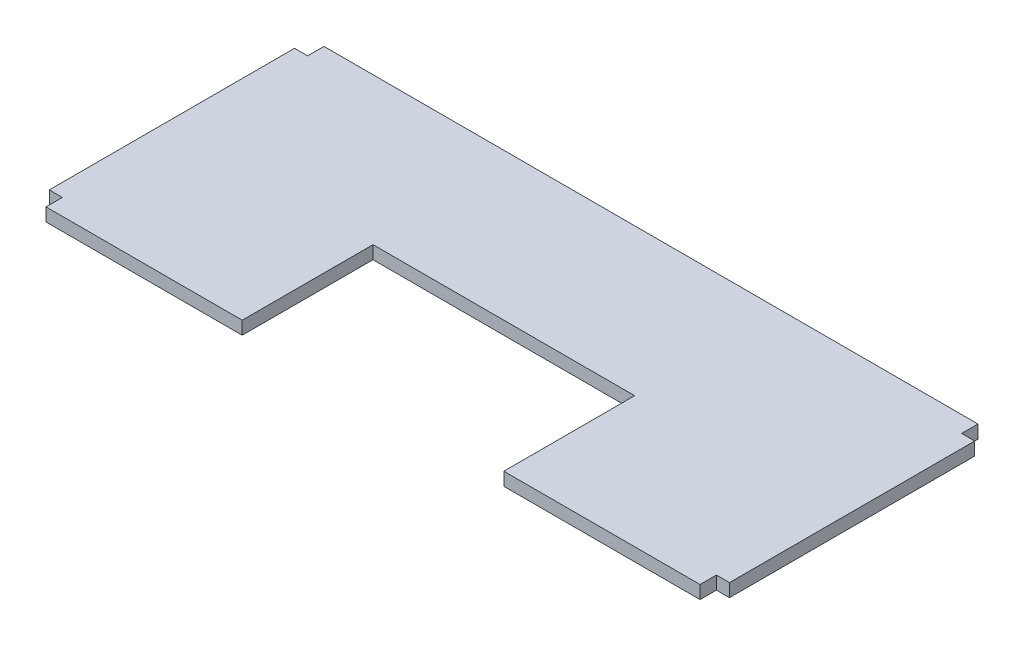
ISO-10303-21;
HEADER;
FILE_DESCRIPTION(('STEP AP214'),'2;1');
FILE_NAME('part.step','',(''),(''),'','','');
FILE_SCHEMA(('AUTOMOTIVE_DESIGN { 1 0 10303 214 1 1 1 1 }'));
ENDSEC;
DATA;
#1=APPLICATION_CONTEXT('core data for automotive mechanical design processes');
#2=APPLICATION_PROTOCOL_DEFINITION('international standard','automotive_design',2000,#1);
#3=PRODUCT_CONTEXT('',#1,'mechanical');
#4=PRODUCT('Part','Part','',(#3));
#5=PRODUCT_RELATED_PRODUCT_CATEGORY('part','',(#4));
#6=PRODUCT_DEFINITION_FORMATION('','',#4);
#7=PRODUCT_DEFINITION_CONTEXT('part definition',#1,'design');
#8=PRODUCT_DEFINITION('design','',#6,#7);
#9=PRODUCT_DEFINITION_SHAPE('','',#8);
#10=(LENGTH_UNIT() NAMED_UNIT(*) SI_UNIT(.MILLI.,.METRE.));
#11=(NAMED_UNIT(*) PLANE_ANGLE_UNIT() SI_UNIT($,.RADIAN.));
#12=(NAMED_UNIT(*) SI_UNIT($,.STERADIAN.) SOLID_ANGLE_UNIT());
#13=UNCERTAINTY_MEASURE_WITH_UNIT(LENGTH_MEASURE(1.E-05),#10,'distance_accuracy_value','');
#14=(GEOMETRIC_REPRESENTATION_CONTEXT(3) GLOBAL_UNCERTAINTY_ASSIGNED_CONTEXT((#13)) GLOBAL_UNIT_ASSIGNED_CONTEXT((#10,
#11,#12)) REPRESENTATION_CONTEXT('',''));
#15=CARTESIAN_POINT('',(0.,0.,0.));
#16=DIRECTION('',(0.,0.,1.));
#17=DIRECTION('',(1.,0.,0.));
#18=AXIS2_PLACEMENT_3D('',#15,#16,#17);
#19=CARTESIAN_POINT('',(0.,2.,0.));
#20=DIRECTION('',(0.,0.,-1.));
#21=DIRECTION('',(-1.,0.,0.));
#22=AXIS2_PLACEMENT_3D('',#19,#20,#21);
#23=PLANE('',#22);
#24=DIRECTION('',(1.,0.,0.));
#25=VECTOR('',#24,1.);
#26=CARTESIAN_POINT('',(0.,0.,0.));
#27=LINE('',#26,#25);
#28=CARTESIAN_POINT('',(0.,0.,0.));
#29=VERTEX_POINT('',#28);
#30=CARTESIAN_POINT('',(30.,0.,0.));
#31=VERTEX_POINT('',#30);
#32=EDGE_CURVE('E249',#29,#31,#27,.T.);
#33=ORIENTED_EDGE('',*,*,#32,.T.);
#34=DIRECTION('',(0.,1.,0.));
#35=VECTOR('',#34,1.);
#36=CARTESIAN_POINT('',(30.,-0.00100000000000013,0.));
#37=LINE('',#36,#35);
#38=CARTESIAN_POINT('',(30.,2.,0.));
#39=VERTEX_POINT('',#38);
#40=EDGE_CURVE('E203',#31,#39,#37,.T.);
#41=ORIENTED_EDGE('',*,*,#40,.T.);
#42=DIRECTION('',(1.,0.,0.));
#43=VECTOR('',#42,1.);
#44=CARTESIAN_POINT('',(0.,2.,0.));
#45=LINE('',#44,#43);
#46=CARTESIAN_POINT('',(0.,2.,0.));
#47=VERTEX_POINT('',#46);
#48=EDGE_CURVE('E192',#47,#39,#45,.T.);
#49=ORIENTED_EDGE('',*,*,#48,.F.);
#50=DIRECTION('',(0.,-1.,0.));
#51=VECTOR('',#50,1.);
#52=CARTESIAN_POINT('',(0.,2.,0.));
#53=LINE('',#52,#51);
#54=EDGE_CURVE('E301',#47,#29,#53,.T.);
#55=ORIENTED_EDGE('',*,*,#54,.T.);
#56=EDGE_LOOP('',(#33,#41,#49,#55));
#57=FACE_BOUND('',#56,.T.);
#58=ADVANCED_FACE('F44',(#57),#23,.F.);
#59=CARTESIAN_POINT('',(-2.,2.,0.));
#60=DIRECTION('',(1.,0.,0.));
#61=DIRECTION('',(0.,0.,-1.));
#62=AXIS2_PLACEMENT_3D('',#59,#60,#61);
#63=PLANE('',#62);
#64=DIRECTION('',(0.,0.,1.));
#65=VECTOR('',#64,1.);
#66=CARTESIAN_POINT('',(-2.,0.,0.));
#67=LINE('',#66,#65);
#68=CARTESIAN_POINT('',(-2.,0.,-40.));
#69=VERTEX_POINT('',#68);
#70=CARTESIAN_POINT('',(-2.,0.,-2.5));
#71=VERTEX_POINT('',#70);
#72=EDGE_CURVE('E202',#69,#71,#67,.T.);
#73=ORIENTED_EDGE('',*,*,#72,.T.);
#74=DIRECTION('',(0.,-1.,0.));
#75=VECTOR('',#74,1.);
#76=CARTESIAN_POINT('',(-2.,2.,-2.5));
#77=LINE('',#76,#75);
#78=CARTESIAN_POINT('',(-2.,2.,-2.5));
#79=VERTEX_POINT('',#78);
#80=EDGE_CURVE('E11',#79,#71,#77,.T.);
#81=ORIENTED_EDGE('',*,*,#80,.F.);
#82=DIRECTION('',(0.,0.,1.));
#83=VECTOR('',#82,1.);
#84=CARTESIAN_POINT('',(-2.,2.,0.));
#85=LINE('',#84,#83);
#86=CARTESIAN_POINT('',(-2.,2.,-40.));
#87=VERTEX_POINT('',#86);
#88=EDGE_CURVE('E193',#87,#79,#85,.T.);
#89=ORIENTED_EDGE('',*,*,#88,.F.);
#90=DIRECTION('',(0.,-1.,0.));
#91=VECTOR('',#90,1.);
#92=CARTESIAN_POINT('',(-2.,2.,-40.));
#93=LINE('',#92,#91);
#94=EDGE_CURVE('E69',#87,#69,#93,.T.);
#95=ORIENTED_EDGE('',*,*,#94,.T.);
#96=EDGE_LOOP('',(#73,#81,#89,#95));
#97=FACE_BOUND('',#96,.T.);
#98=ADVANCED_FACE('F46',(#97),#63,.F.);
#99=CARTESIAN_POINT('',(0.,2.,-2.5));
#100=DIRECTION('',(0.,0.,-1.));
#101=DIRECTION('',(-1.,0.,0.));
#102=AXIS2_PLACEMENT_3D('',#99,#100,#101);
#103=PLANE('',#102);
#104=DIRECTION('',(1.,0.,0.));
#105=VECTOR('',#104,1.);
#106=CARTESIAN_POINT('',(0.,0.,-2.5));
#107=LINE('',#106,#105);
#108=CARTESIAN_POINT('',(0.,0.,-2.5));
#109=VERTEX_POINT('',#108);
#110=EDGE_CURVE('E237',#71,#109,#107,.T.);
#111=ORIENTED_EDGE('',*,*,#110,.T.);
#112=DIRECTION('',(0.,-1.,0.));
#113=VECTOR('',#112,1.);
#114=CARTESIAN_POINT('',(0.,2.,-2.5));
#115=LINE('',#114,#113);
#116=CARTESIAN_POINT('',(0.,2.,-2.5));
#117=VERTEX_POINT('',#116);
#118=EDGE_CURVE('E53',#117,#109,#115,.T.);
#119=ORIENTED_EDGE('',*,*,#118,.F.);
#120=DIRECTION('',(1.,0.,0.));
#121=VECTOR('',#120,1.);
#122=CARTESIAN_POINT('',(0.,2.,-2.5));
#123=LINE('',#122,#121);
#124=EDGE_CURVE('E120',#79,#117,#123,.T.);
#125=ORIENTED_EDGE('',*,*,#124,.F.);
#126=ORIENTED_EDGE('',*,*,#80,.T.);
#127=EDGE_LOOP('',(#111,#119,#125,#126));
#128=FACE_BOUND('',#127,.T.);
#129=ADVANCED_FACE('F306',(#128),#103,.F.);
#130=CARTESIAN_POINT('',(0.,2.,0.));
#131=DIRECTION('',(-1.,0.,0.));
#132=DIRECTION('',(0.,0.,1.));
#133=AXIS2_PLACEMENT_3D('',#130,#131,#132);
#134=PLANE('',#133);
#135=DIRECTION('',(0.,0.,-1.));
#136=VECTOR('',#135,1.);
#137=CARTESIAN_POINT('',(0.,0.,0.));
#138=LINE('',#137,#136);
#139=EDGE_CURVE('E241',#29,#109,#138,.T.);
#140=ORIENTED_EDGE('',*,*,#139,.F.);
#141=ORIENTED_EDGE('',*,*,#54,.F.);
#142=DIRECTION('',(0.,0.,-1.));
#143=VECTOR('',#142,1.);
#144=CARTESIAN_POINT('',(0.,2.,0.));
#145=LINE('',#144,#143);
#146=EDGE_CURVE('E180',#47,#117,#145,.T.);
#147=ORIENTED_EDGE('',*,*,#146,.T.);
#148=ORIENTED_EDGE('',*,*,#118,.T.);
#149=EDGE_LOOP('',(#140,#141,#147,#148));
#150=FACE_BOUND('',#149,.T.);
#151=ADVANCED_FACE('F305',(#150),#134,.T.);
#152=CARTESIAN_POINT('',(70.,2.,0.));
#153=VERTEX_POINT('',#152);
#154=CARTESIAN_POINT('',(100.,2.,0.));
#155=VERTEX_POINT('',#154);
#156=EDGE_CURVE('E187',#153,#155,#45,.T.);
#157=ORIENTED_EDGE('',*,*,#156,.F.);
#158=DIRECTION('',(0.,1.,0.));
#159=VECTOR('',#158,1.);
#160=CARTESIAN_POINT('',(70.,-0.00100000000000013,0.));
#161=LINE('',#160,#159);
#162=CARTESIAN_POINT('',(70.,0.,0.));
#163=VERTEX_POINT('',#162);
#164=EDGE_CURVE('E204',#163,#153,#161,.T.);
#165=ORIENTED_EDGE('',*,*,#164,.F.);
#166=CARTESIAN_POINT('',(100.,0.,0.));
#167=VERTEX_POINT('',#166);
#168=EDGE_CURVE('E245',#163,#167,#27,.T.);
#169=ORIENTED_EDGE('',*,*,#168,.T.);
#170=DIRECTION('',(0.,-1.,0.));
#171=VECTOR('',#170,1.);
#172=CARTESIAN_POINT('',(100.,2.,0.));
#173=LINE('',#172,#171);
#174=EDGE_CURVE('E297',#155,#167,#173,.T.);
#175=ORIENTED_EDGE('',*,*,#174,.F.);
#176=EDGE_LOOP('',(#157,#165,#169,#175));
#177=FACE_BOUND('',#176,.T.);
#178=ADVANCED_FACE('F335',(#177),#23,.F.);
#179=CARTESIAN_POINT('',(100.,2.,0.));
#180=DIRECTION('',(-1.,0.,0.));
#181=DIRECTION('',(0.,0.,1.));
#182=AXIS2_PLACEMENT_3D('',#179,#180,#181);
#183=PLANE('',#182);
#184=DIRECTION('',(0.,0.,-1.));
#185=VECTOR('',#184,1.);
#186=CARTESIAN_POINT('',(100.,0.,0.));
#187=LINE('',#186,#185);
#188=CARTESIAN_POINT('',(100.,0.,-2.5));
#189=VERTEX_POINT('',#188);
#190=EDGE_CURVE('E253',#167,#189,#187,.T.);
#191=ORIENTED_EDGE('',*,*,#190,.T.);
#192=DIRECTION('',(0.,-1.,0.));
#193=VECTOR('',#192,1.);
#194=CARTESIAN_POINT('',(100.,2.,-2.5));
#195=LINE('',#194,#193);
#196=CARTESIAN_POINT('',(100.,2.,-2.5));
#197=VERTEX_POINT('',#196);
#198=EDGE_CURVE('E293',#197,#189,#195,.T.);
#199=ORIENTED_EDGE('',*,*,#198,.F.);
#200=DIRECTION('',(0.,0.,-1.));
#201=VECTOR('',#200,1.);
#202=CARTESIAN_POINT('',(100.,2.,0.));
#203=LINE('',#202,#201);
#204=EDGE_CURVE('E352',#155,#197,#203,.T.);
#205=ORIENTED_EDGE('',*,*,#204,.F.);
#206=ORIENTED_EDGE('',*,*,#174,.T.);
#207=EDGE_LOOP('',(#191,#199,#205,#206));
#208=FACE_BOUND('',#207,.T.);
#209=ADVANCED_FACE('F341',(#208),#183,.F.);
#210=CARTESIAN_POINT('',(0.,2.,-2.5));
#211=DIRECTION('',(0.,0.,-1.));
#212=DIRECTION('',(-1.,0.,0.));
#213=AXIS2_PLACEMENT_3D('',#210,#211,#212);
#214=PLANE('',#213);
#215=DIRECTION('',(1.,0.,0.));
#216=VECTOR('',#215,1.);
#217=CARTESIAN_POINT('',(0.,0.,-2.5));
#218=LINE('',#217,#216);
#219=CARTESIAN_POINT('',(102.,0.,-2.5));
#220=VERTEX_POINT('',#219);
#221=EDGE_CURVE('E255',#189,#220,#218,.T.);
#222=ORIENTED_EDGE('',*,*,#221,.T.);
#223=DIRECTION('',(0.,-1.,0.));
#224=VECTOR('',#223,1.);
#225=CARTESIAN_POINT('',(102.,2.,-2.5));
#226=LINE('',#225,#224);
#227=CARTESIAN_POINT('',(102.,2.,-2.5));
#228=VERTEX_POINT('',#227);
#229=EDGE_CURVE('E290',#228,#220,#226,.T.);
#230=ORIENTED_EDGE('',*,*,#229,.F.);
#231=DIRECTION('',(1.,0.,0.));
#232=VECTOR('',#231,1.);
#233=CARTESIAN_POINT('',(0.,2.,-2.5));
#234=LINE('',#233,#232);
#235=EDGE_CURVE('E347',#197,#228,#234,.T.);
#236=ORIENTED_EDGE('',*,*,#235,.F.);
#237=ORIENTED_EDGE('',*,*,#198,.T.);
#238=EDGE_LOOP('',(#222,#230,#236,#237));
#239=FACE_BOUND('',#238,.T.);
#240=ADVANCED_FACE('F345',(#239),#214,.F.);
#241=CARTESIAN_POINT('',(102.,2.,0.));
#242=DIRECTION('',(1.,0.,0.));
#243=DIRECTION('',(0.,0.,-1.));
#244=AXIS2_PLACEMENT_3D('',#241,#242,#243);
#245=PLANE('',#244);
#246=DIRECTION('',(0.,0.,1.));
#247=VECTOR('',#246,1.);
#248=CARTESIAN_POINT('',(102.,0.,0.));
#249=LINE('',#248,#247);
#250=CARTESIAN_POINT('',(102.,0.,-40.));
#251=VERTEX_POINT('',#250);
#252=EDGE_CURVE('E260',#251,#220,#249,.T.);
#253=ORIENTED_EDGE('',*,*,#252,.F.);
#254=DIRECTION('',(0.,-1.,0.));
#255=VECTOR('',#254,1.);
#256=CARTESIAN_POINT('',(102.,2.,-40.));
#257=LINE('',#256,#255);
#258=CARTESIAN_POINT('',(102.,2.,-40.));
#259=VERTEX_POINT('',#258);
#260=EDGE_CURVE('E287',#259,#251,#257,.T.);
#261=ORIENTED_EDGE('',*,*,#260,.F.);
#262=DIRECTION('',(0.,0.,1.));
#263=VECTOR('',#262,1.);
#264=CARTESIAN_POINT('',(102.,2.,0.));
#265=LINE('',#264,#263);
#266=EDGE_CURVE('E351',#259,#228,#265,.T.);
#267=ORIENTED_EDGE('',*,*,#266,.T.);
#268=ORIENTED_EDGE('',*,*,#229,.T.);
#269=EDGE_LOOP('',(#253,#261,#267,#268));
#270=FACE_BOUND('',#269,.T.);
#271=ADVANCED_FACE('F368',(#270),#245,.T.);
#272=CARTESIAN_POINT('',(0.,2.,-40.));
#273=DIRECTION('',(0.,0.,-1.));
#274=DIRECTION('',(-1.,0.,0.));
#275=AXIS2_PLACEMENT_3D('',#272,#273,#274);
#276=PLANE('',#275);
#277=DIRECTION('',(1.,0.,0.));
#278=VECTOR('',#277,1.);
#279=CARTESIAN_POINT('',(0.,0.,-40.));
#280=LINE('',#279,#278);
#281=CARTESIAN_POINT('',(100.,0.,-40.));
#282=VERTEX_POINT('',#281);
#283=EDGE_CURVE('E264',#282,#251,#280,.T.);
#284=ORIENTED_EDGE('',*,*,#283,.F.);
#285=DIRECTION('',(0.,-1.,0.));
#286=VECTOR('',#285,1.);
#287=CARTESIAN_POINT('',(100.,2.,-40.));
#288=LINE('',#287,#286);
#289=CARTESIAN_POINT('',(100.,2.,-40.));
#290=VERTEX_POINT('',#289);
#291=EDGE_CURVE('E284',#290,#282,#288,.T.);
#292=ORIENTED_EDGE('',*,*,#291,.F.);
#293=DIRECTION('',(1.,0.,0.));
#294=VECTOR('',#293,1.);
#295=CARTESIAN_POINT('',(0.,2.,-40.));
#296=LINE('',#295,#294);
#297=EDGE_CURVE('E356',#290,#259,#296,.T.);
#298=ORIENTED_EDGE('',*,*,#297,.T.);
#299=ORIENTED_EDGE('',*,*,#260,.T.);
#300=EDGE_LOOP('',(#284,#292,#298,#299));
#301=FACE_BOUND('',#300,.T.);
#302=ADVANCED_FACE('F365',(#301),#276,.T.);
#303=CARTESIAN_POINT('',(100.,0.,-42.5));
#304=VERTEX_POINT('',#303);
#305=EDGE_CURVE('E257',#282,#304,#187,.T.);
#306=ORIENTED_EDGE('',*,*,#305,.T.);
#307=DIRECTION('',(0.,-1.,0.));
#308=VECTOR('',#307,1.);
#309=CARTESIAN_POINT('',(100.,2.,-42.5));
#310=LINE('',#309,#308);
#311=CARTESIAN_POINT('',(100.,2.,-42.5));
#312=VERTEX_POINT('',#311);
#313=EDGE_CURVE('E161',#312,#304,#310,.T.);
#314=ORIENTED_EDGE('',*,*,#313,.F.);
#315=EDGE_CURVE('E172',#290,#312,#203,.T.);
#316=ORIENTED_EDGE('',*,*,#315,.F.);
#317=ORIENTED_EDGE('',*,*,#291,.T.);
#318=EDGE_LOOP('',(#306,#314,#316,#317));
#319=FACE_BOUND('',#318,.T.);
#320=ADVANCED_FACE('F371',(#319),#183,.F.);
#321=CARTESIAN_POINT('',(0.,2.,-42.5));
#322=DIRECTION('',(0.,0.,-1.));
#323=DIRECTION('',(-1.,0.,0.));
#324=AXIS2_PLACEMENT_3D('',#321,#322,#323);
#325=PLANE('',#324);
#326=DIRECTION('',(1.,0.,0.));
#327=VECTOR('',#326,1.);
#328=CARTESIAN_POINT('',(0.,0.,-42.5));
#329=LINE('',#328,#327);
#330=CARTESIAN_POINT('',(0.,0.,-42.5));
#331=VERTEX_POINT('',#330);
#332=EDGE_CURVE('E155',#331,#304,#329,.T.);
#333=ORIENTED_EDGE('',*,*,#332,.F.);
#334=DIRECTION('',(0.,-1.,0.));
#335=VECTOR('',#334,1.);
#336=CARTESIAN_POINT('',(0.,2.,-42.5));
#337=LINE('',#336,#335);
#338=CARTESIAN_POINT('',(0.,2.,-42.5));
#339=VERTEX_POINT('',#338);
#340=EDGE_CURVE('E150',#339,#331,#337,.T.);
#341=ORIENTED_EDGE('',*,*,#340,.F.);
#342=DIRECTION('',(1.,0.,0.));
#343=VECTOR('',#342,1.);
#344=CARTESIAN_POINT('',(0.,2.,-42.5));
#345=LINE('',#344,#343);
#346=EDGE_CURVE('E153',#339,#312,#345,.T.);
#347=ORIENTED_EDGE('',*,*,#346,.T.);
#348=ORIENTED_EDGE('',*,*,#313,.T.);
#349=EDGE_LOOP('',(#333,#341,#347,#348));
#350=FACE_BOUND('',#349,.T.);
#351=ADVANCED_FACE('F152',(#350),#325,.T.);
#352=CARTESIAN_POINT('',(0.,0.,-40.));
#353=VERTEX_POINT('',#352);
#354=EDGE_CURVE('E247',#353,#331,#138,.T.);
#355=ORIENTED_EDGE('',*,*,#354,.F.);
#356=DIRECTION('',(0.,-1.,0.));
#357=VECTOR('',#356,1.);
#358=CARTESIAN_POINT('',(0.,2.,-40.));
#359=LINE('',#358,#357);
#360=CARTESIAN_POINT('',(0.,2.,-40.));
#361=VERTEX_POINT('',#360);
#362=EDGE_CURVE('E162',#361,#353,#359,.T.);
#363=ORIENTED_EDGE('',*,*,#362,.F.);
#364=EDGE_CURVE('E169',#361,#339,#145,.T.);
#365=ORIENTED_EDGE('',*,*,#364,.T.);
#366=ORIENTED_EDGE('',*,*,#340,.T.);
#367=EDGE_LOOP('',(#355,#363,#365,#366));
#368=FACE_BOUND('',#367,.T.);
#369=ADVANCED_FACE('F176',(#368),#134,.T.);
#370=CARTESIAN_POINT('',(0.,2.,-40.));
#371=DIRECTION('',(0.,0.,-1.));
#372=DIRECTION('',(-1.,0.,0.));
#373=AXIS2_PLACEMENT_3D('',#370,#371,#372);
#374=PLANE('',#373);
#375=DIRECTION('',(1.,0.,0.));
#376=VECTOR('',#375,1.);
#377=CARTESIAN_POINT('',(0.,0.,-40.));
#378=LINE('',#377,#376);
#379=EDGE_CURVE('E195',#69,#353,#378,.T.);
#380=ORIENTED_EDGE('',*,*,#379,.F.);
#381=ORIENTED_EDGE('',*,*,#94,.F.);
#382=DIRECTION('',(1.,0.,0.));
#383=VECTOR('',#382,1.);
#384=CARTESIAN_POINT('',(0.,2.,-40.));
#385=LINE('',#384,#383);
#386=EDGE_CURVE('E178',#87,#361,#385,.T.);
#387=ORIENTED_EDGE('',*,*,#386,.T.);
#388=ORIENTED_EDGE('',*,*,#362,.T.);
#389=EDGE_LOOP('',(#380,#381,#387,#388));
#390=FACE_BOUND('',#389,.T.);
#391=ADVANCED_FACE('F399',(#390),#374,.T.);
#392=CARTESIAN_POINT('',(0.,2.,0.));
#393=DIRECTION('',(0.,1.,0.));
#394=DIRECTION('',(0.,0.,1.));
#395=AXIS2_PLACEMENT_3D('',#392,#393,#394);
#396=PLANE('',#395);
#397=DIRECTION('',(0.,0.,1.));
#398=VECTOR('',#397,1.);
#399=CARTESIAN_POINT('',(30.,2.,0.));
#400=LINE('',#399,#398);
#401=CARTESIAN_POINT('',(30.,2.,-20.));
#402=VERTEX_POINT('',#401);
#403=EDGE_CURVE('E209',#402,#39,#400,.T.);
#404=ORIENTED_EDGE('',*,*,#403,.F.);
#405=DIRECTION('',(-1.,0.,0.));
#406=VECTOR('',#405,1.);
#407=CARTESIAN_POINT('',(30.,2.,-20.));
#408=LINE('',#407,#406);
#409=CARTESIAN_POINT('',(70.,2.,-20.));
#410=VERTEX_POINT('',#409);
#411=EDGE_CURVE('E222',#410,#402,#408,.T.);
#412=ORIENTED_EDGE('',*,*,#411,.F.);
#413=DIRECTION('',(0.,0.,-1.));
#414=VECTOR('',#413,1.);
#415=CARTESIAN_POINT('',(70.,2.,0.));
#416=LINE('',#415,#414);
#417=EDGE_CURVE('E226',#153,#410,#416,.T.);
#418=ORIENTED_EDGE('',*,*,#417,.F.);
#419=ORIENTED_EDGE('',*,*,#156,.T.);
#420=ORIENTED_EDGE('',*,*,#204,.T.);
#421=ORIENTED_EDGE('',*,*,#235,.T.);
#422=ORIENTED_EDGE('',*,*,#266,.F.);
#423=ORIENTED_EDGE('',*,*,#297,.F.);
#424=ORIENTED_EDGE('',*,*,#315,.T.);
#425=ORIENTED_EDGE('',*,*,#346,.F.);
#426=ORIENTED_EDGE('',*,*,#364,.F.);
#427=ORIENTED_EDGE('',*,*,#386,.F.);
#428=ORIENTED_EDGE('',*,*,#88,.T.);
#429=ORIENTED_EDGE('',*,*,#124,.T.);
#430=ORIENTED_EDGE('',*,*,#146,.F.);
#431=ORIENTED_EDGE('',*,*,#48,.T.);
#432=EDGE_LOOP('',(#404,#412,#418,#419,#420,#421,#422,#423,#424,#425,#426,#427,#428,#429,#430,#431));
#433=FACE_BOUND('',#432,.T.);
#434=ADVANCED_FACE('F167',(#433),#396,.T.);
#435=CARTESIAN_POINT('',(0.,0.,0.));
#436=DIRECTION('',(0.,1.,0.));
#437=DIRECTION('',(0.,0.,1.));
#438=AXIS2_PLACEMENT_3D('',#435,#436,#437);
#439=PLANE('',#438);
#440=DIRECTION('',(1.,0.,0.));
#441=VECTOR('',#440,1.);
#442=CARTESIAN_POINT('',(30.,0.,-20.));
#443=LINE('',#442,#441);
#444=CARTESIAN_POINT('',(30.,0.,-20.));
#445=VERTEX_POINT('',#444);
#446=CARTESIAN_POINT('',(70.,0.,-20.));
#447=VERTEX_POINT('',#446);
#448=EDGE_CURVE('E60',#445,#447,#443,.T.);
#449=ORIENTED_EDGE('',*,*,#448,.F.);
#450=DIRECTION('',(0.,0.,-1.));
#451=VECTOR('',#450,1.);
#452=CARTESIAN_POINT('',(30.,0.,0.));
#453=LINE('',#452,#451);
#454=EDGE_CURVE('E230',#31,#445,#453,.T.);
#455=ORIENTED_EDGE('',*,*,#454,.F.);
#456=ORIENTED_EDGE('',*,*,#32,.F.);
#457=ORIENTED_EDGE('',*,*,#139,.T.);
#458=ORIENTED_EDGE('',*,*,#110,.F.);
#459=ORIENTED_EDGE('',*,*,#72,.F.);
#460=ORIENTED_EDGE('',*,*,#379,.T.);
#461=ORIENTED_EDGE('',*,*,#354,.T.);
#462=ORIENTED_EDGE('',*,*,#332,.T.);
#463=ORIENTED_EDGE('',*,*,#305,.F.);
#464=ORIENTED_EDGE('',*,*,#283,.T.);
#465=ORIENTED_EDGE('',*,*,#252,.T.);
#466=ORIENTED_EDGE('',*,*,#221,.F.);
#467=ORIENTED_EDGE('',*,*,#190,.F.);
#468=ORIENTED_EDGE('',*,*,#168,.F.);
#469=DIRECTION('',(0.,0.,1.));
#470=VECTOR('',#469,1.);
#471=CARTESIAN_POINT('',(70.,0.,0.));
#472=LINE('',#471,#470);
#473=EDGE_CURVE('E198',#447,#163,#472,.T.);
#474=ORIENTED_EDGE('',*,*,#473,.F.);
#475=EDGE_LOOP('',(#449,#455,#456,#457,#458,#459,#460,#461,#462,#463,#464,#465,#466,#467,#468,#474));
#476=FACE_BOUND('',#475,.T.);
#477=ADVANCED_FACE('F309',(#476),#439,.F.);
#478=CARTESIAN_POINT('',(30.,-0.00100000000000013,0.));
#479=DIRECTION('',(-1.,0.,0.));
#480=DIRECTION('',(0.,0.,1.));
#481=AXIS2_PLACEMENT_3D('',#478,#479,#480);
#482=PLANE('',#481);
#483=ORIENTED_EDGE('',*,*,#454,.T.);
#484=DIRECTION('',(0.,1.,0.));
#485=VECTOR('',#484,1.);
#486=CARTESIAN_POINT('',(30.,-0.00100000000000013,-20.));
#487=LINE('',#486,#485);
#488=EDGE_CURVE('E212',#445,#402,#487,.T.);
#489=ORIENTED_EDGE('',*,*,#488,.T.);
#490=ORIENTED_EDGE('',*,*,#403,.T.);
#491=ORIENTED_EDGE('',*,*,#40,.F.);
#492=EDGE_LOOP('',(#483,#489,#490,#491));
#493=FACE_BOUND('',#492,.T.);
#494=ADVANCED_FACE('F408',(#493),#482,.F.);
#495=CARTESIAN_POINT('',(30.,-0.00100000000000013,-20.));
#496=DIRECTION('',(0.,0.,-1.));
#497=DIRECTION('',(-1.,0.,0.));
#498=AXIS2_PLACEMENT_3D('',#495,#496,#497);
#499=PLANE('',#498);
#500=ORIENTED_EDGE('',*,*,#448,.T.);
#501=DIRECTION('',(0.,1.,0.));
#502=VECTOR('',#501,1.);
#503=CARTESIAN_POINT('',(70.,-0.00100000000000013,-20.));
#504=LINE('',#503,#502);
#505=EDGE_CURVE('E208',#447,#410,#504,.T.);
#506=ORIENTED_EDGE('',*,*,#505,.T.);
#507=ORIENTED_EDGE('',*,*,#411,.T.);
#508=ORIENTED_EDGE('',*,*,#488,.F.);
#509=EDGE_LOOP('',(#500,#506,#507,#508));
#510=FACE_BOUND('',#509,.T.);
#511=ADVANCED_FACE('F412',(#510),#499,.F.);
#512=CARTESIAN_POINT('',(70.,-0.00100000000000013,0.));
#513=DIRECTION('',(1.,0.,0.));
#514=DIRECTION('',(0.,0.,-1.));
#515=AXIS2_PLACEMENT_3D('',#512,#513,#514);
#516=PLANE('',#515);
#517=ORIENTED_EDGE('',*,*,#473,.T.);
#518=ORIENTED_EDGE('',*,*,#164,.T.);
#519=ORIENTED_EDGE('',*,*,#417,.T.);
#520=ORIENTED_EDGE('',*,*,#505,.F.);
#521=EDGE_LOOP('',(#517,#518,#519,#520));
#522=FACE_BOUND('',#521,.T.);
#523=ADVANCED_FACE('F330',(#522),#516,.F.);
#524=CLOSED_SHELL('',(#58,#98,#129,#151,#178,#209,#240,#271,#302,#320,#351,#369,#391,#434,#477,
#494,#511,#523));
#525=MANIFOLD_SOLID_BREP('B2',#524);
#526=ADVANCED_BREP_SHAPE_REPRESENTATION('',(#18,#525),#14);
#527=SHAPE_DEFINITION_REPRESENTATION(#9,#526);
ENDSEC;
END-ISO-10303-21;
